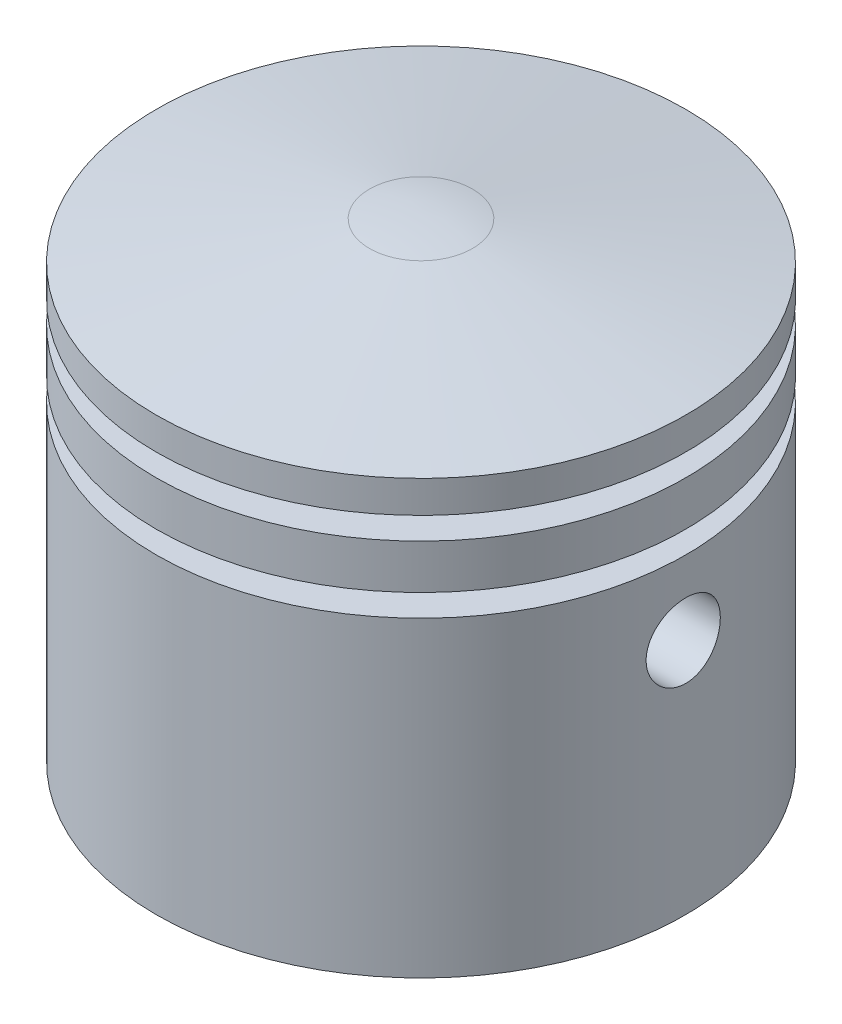
ISO-10303-21;
HEADER;
FILE_DESCRIPTION(('STEP AP214'),'2;1');
FILE_NAME('part.step','',(''),(''),'','','');
FILE_SCHEMA(('AUTOMOTIVE_DESIGN { 1 0 10303 214 1 1 1 1 }'));
ENDSEC;
DATA;
#1=APPLICATION_CONTEXT('core data for automotive mechanical design processes');
#2=APPLICATION_PROTOCOL_DEFINITION('international standard','automotive_design',2000,#1);
#3=PRODUCT_CONTEXT('',#1,'mechanical');
#4=PRODUCT('Part','Part','',(#3));
#5=PRODUCT_RELATED_PRODUCT_CATEGORY('part','',(#4));
#6=PRODUCT_DEFINITION_FORMATION('','',#4);
#7=PRODUCT_DEFINITION_CONTEXT('part definition',#1,'design');
#8=PRODUCT_DEFINITION('design','',#6,#7);
#9=PRODUCT_DEFINITION_SHAPE('','',#8);
#10=(LENGTH_UNIT() NAMED_UNIT(*) SI_UNIT(.MILLI.,.METRE.));
#11=(NAMED_UNIT(*) PLANE_ANGLE_UNIT() SI_UNIT($,.RADIAN.));
#12=(NAMED_UNIT(*) SI_UNIT($,.STERADIAN.) SOLID_ANGLE_UNIT());
#13=UNCERTAINTY_MEASURE_WITH_UNIT(LENGTH_MEASURE(1.E-05),#10,'distance_accuracy_value','');
#14=(GEOMETRIC_REPRESENTATION_CONTEXT(3) GLOBAL_UNCERTAINTY_ASSIGNED_CONTEXT((#13)) GLOBAL_UNIT_ASSIGNED_CONTEXT((#10,
#11,#12)) REPRESENTATION_CONTEXT('',''));
#15=CARTESIAN_POINT('',(0.,0.,0.));
#16=DIRECTION('',(0.,0.,1.));
#17=DIRECTION('',(1.,0.,0.));
#18=AXIS2_PLACEMENT_3D('',#15,#16,#17);
#19=CARTESIAN_POINT('',(0.,-0.896664696993895,0.));
#20=DIRECTION('',(0.,1.,0.));
#21=DIRECTION('',(-1.,0.,0.));
#22=AXIS2_PLACEMENT_3D('',#19,#20,#21);
#23=SPHERICAL_SURFACE('',#22,20.);
#24=CARTESIAN_POINT('',(0.,18.7994903632503,0.));
#25=DIRECTION('',(0.,1.,0.));
#26=DIRECTION('',(0.,0.,1.));
#27=AXIS2_PLACEMENT_3D('',#24,#25,#26);
#28=CIRCLE('',#27,3.47296355333832);
#29=CARTESIAN_POINT('',(0.,18.7994903632503,-3.47296355333834));
#30=VERTEX_POINT('',#29);
#31=EDGE_CURVE('E10',#30,#30,#28,.T.);
#32=ORIENTED_EDGE('',*,*,#31,.T.);
#33=EDGE_LOOP('',(#32));
#34=FACE_BOUND('',#33,.T.);
#35=ADVANCED_FACE('F37',(#34),#23,.T.);
#36=CARTESIAN_POINT('',(0.,16.2647861186848,0.));
#37=DIRECTION('',(0.,-1.,0.));
#38=DIRECTION('',(0.,0.,-1.));
#39=AXIS2_PLACEMENT_3D('',#36,#37,#38);
#40=CONICAL_SURFACE('',#39,17.847985653652,1.39626340159548);
#41=CARTESIAN_POINT('',(0.,16.2647861186848,0.));
#42=DIRECTION('',(0.,1.,0.));
#43=DIRECTION('',(0.,0.,1.));
#44=AXIS2_PLACEMENT_3D('',#41,#42,#43);
#45=CIRCLE('',#44,17.847985653652);
#46=CARTESIAN_POINT('',(0.,16.2647861186847,-17.8479856536521));
#47=VERTEX_POINT('',#46);
#48=EDGE_CURVE('E49',#47,#47,#45,.T.);
#49=CARTESIAN_POINT('',(0.,18.7994903632503,-3.47296355333834));
#50=CARTESIAN_POINT('',(0.,18.7730871940361,-3.62270336688327));
#51=CARTESIAN_POINT('',(0.,18.7466840248219,-3.77244318042821));
#52=CARTESIAN_POINT('',(0.,18.6938776863934,-4.07192280751808));
#53=CARTESIAN_POINT('',(0.,18.6674745171792,-4.22166262106301));
#54=CARTESIAN_POINT('',(0.,18.6146681787507,-4.52114224815288));
#55=CARTESIAN_POINT('',(0.,18.5882650095365,-4.67088206169781));
#56=CARTESIAN_POINT('',(0.,18.5354586711081,-4.97036168878768));
#57=CARTESIAN_POINT('',(0.,18.5090555018938,-5.12010150233262));
#58=CARTESIAN_POINT('',(0.,18.4562491634654,-5.41958112942249));
#59=CARTESIAN_POINT('',(0.,18.4298459942512,-5.56932094296742));
#60=CARTESIAN_POINT('',(0.,18.3770396558227,-5.86880057005729));
#61=CARTESIAN_POINT('',(0.,18.3506364866085,-6.01854038360222));
#62=CARTESIAN_POINT('',(0.,18.29783014818,-6.31802001069209));
#63=CARTESIAN_POINT('',(0.,18.2714269789658,-6.46775982423703));
#64=CARTESIAN_POINT('',(0.,18.2186206405374,-6.7672394513269));
#65=CARTESIAN_POINT('',(0.,18.1922174713231,-6.91697926487183));
#66=CARTESIAN_POINT('',(0.,18.1394111328947,-7.2164588919617));
#67=CARTESIAN_POINT('',(0.,18.1130079636805,-7.36619870550664));
#68=CARTESIAN_POINT('',(0.,18.060201625252,-7.6656783325965));
#69=CARTESIAN_POINT('',(0.,18.0337984560378,-7.81541814614144));
#70=CARTESIAN_POINT('',(0.,17.9809921176094,-8.11489777323131));
#71=CARTESIAN_POINT('',(0.,17.9545889483951,-8.26463758677624));
#72=CARTESIAN_POINT('',(0.,17.9017826099667,-8.56411721386611));
#73=CARTESIAN_POINT('',(0.,17.8753794407525,-8.71385702741105));
#74=CARTESIAN_POINT('',(0.,17.822573102324,-9.01333665450091));
#75=CARTESIAN_POINT('',(0.,17.7961699331098,-9.16307646804585));
#76=CARTESIAN_POINT('',(0.,17.7433635946813,-9.46255609513572));
#77=CARTESIAN_POINT('',(0.,17.7169604254671,-9.61229590868065));
#78=CARTESIAN_POINT('',(0.,17.6641540870387,-9.91177553577052));
#79=CARTESIAN_POINT('',(0.,17.6377509178244,-10.0615153493155));
#80=CARTESIAN_POINT('',(0.,17.584944579396,-10.3609949764053));
#81=CARTESIAN_POINT('',(0.,17.5585414101818,-10.5107347899503));
#82=CARTESIAN_POINT('',(0.,17.5057350717533,-10.8102144170401));
#83=CARTESIAN_POINT('',(0.,17.4793319025391,-10.9599542305851));
#84=CARTESIAN_POINT('',(0.,17.4265255641106,-11.2594338576749));
#85=CARTESIAN_POINT('',(0.,17.4001223948964,-11.4091736712199));
#86=CARTESIAN_POINT('',(0.,17.347316056468,-11.7086532983097));
#87=CARTESIAN_POINT('',(0.,17.3209128872537,-11.8583931118547));
#88=CARTESIAN_POINT('',(0.,17.2681065488253,-12.1578727389445));
#89=CARTESIAN_POINT('',(0.,17.2417033796111,-12.3076125524895));
#90=CARTESIAN_POINT('',(0.,17.1888970411826,-12.6070921795793));
#91=CARTESIAN_POINT('',(0.,17.1624938719684,-12.7568319931243));
#92=CARTESIAN_POINT('',(0.,17.1096875335399,-13.0563116202141));
#93=CARTESIAN_POINT('',(0.,17.0832843643257,-13.2060514337591));
#94=CARTESIAN_POINT('',(0.,17.0304780258973,-13.505531060849));
#95=CARTESIAN_POINT('',(0.,17.004074856683,-13.6552708743939));
#96=CARTESIAN_POINT('',(0.,16.9512685182546,-13.9547505014838));
#97=CARTESIAN_POINT('',(0.,16.9248653490404,-14.1044903150287));
#98=CARTESIAN_POINT('',(0.,16.8720590106119,-14.4039699421186));
#99=CARTESIAN_POINT('',(0.,16.8456558413977,-14.5537097556635));
#100=CARTESIAN_POINT('',(0.,16.7928495029692,-14.8531893827534));
#101=CARTESIAN_POINT('',(0.,16.766446333755,-15.0029291962983));
#102=CARTESIAN_POINT('',(0.,16.7136399953266,-15.3024088233882));
#103=CARTESIAN_POINT('',(0.,16.6872368261123,-15.4521486369331));
#104=CARTESIAN_POINT('',(0.,16.6344304876839,-15.751628264023));
#105=CARTESIAN_POINT('',(0.,16.6080273184697,-15.9013680775679));
#106=CARTESIAN_POINT('',(0.,16.5552209800412,-16.2008477046578));
#107=CARTESIAN_POINT('',(0.,16.528817810827,-16.3505875182027));
#108=CARTESIAN_POINT('',(0.,16.4760114723986,-16.6500671452926));
#109=CARTESIAN_POINT('',(0.,16.4496083031843,-16.7998069588375));
#110=CARTESIAN_POINT('',(0.,16.3968019647559,-17.0992865859274));
#111=CARTESIAN_POINT('',(0.,16.3703987955416,-17.2490263994723));
#112=CARTESIAN_POINT('',(0.,16.3175924571132,-17.5485060265622));
#113=CARTESIAN_POINT('',(0.,16.291189287899,-17.6982458401071));
#114=CARTESIAN_POINT('',(0.,16.2647861186848,-17.8479856536521));
#115=B_SPLINE_CURVE_WITH_KNOTS('',3,(#49,#50,#51,#52,#53,#54,#55,#56,#57,#58,#59,#60,#61,#62,
#63,#64,#65,#66,#67,#68,#69,#70,#71,#72,#73,#74,#75,#76,#77,#78,#79,#80,#81,#82,#83,#84,#85,#86,
#87,#88,#89,#90,#91,#92,#93,#94,#95,#96,#97,#98,#99,#100,#101,#102,#103,#104,#105,#106,#107,
#108,#109,#110,#111,#112,#113,#114),.UNSPECIFIED.,.F.,.F.,(4,2,2,2,2,2,2,2,2,2,2,2,2,2,2,2,2,2,
2,2,2,2,2,2,2,2,2,2,2,2,2,2,4),(0.,0.456149374597007,0.912298749194014,1.36844812379102,
1.82459749838803,2.28074687298504,2.73689624758204,3.19304562217905,3.64919499677606,
4.10534437137306,4.56149374597007,5.01764312056708,5.47379249516408,5.92994186976109,
6.3860912443581,6.84224061895511,7.29838999355211,7.75453936814912,8.21068874274613,
8.66683811734313,9.12298749194014,9.57913686653715,10.0352862411342,10.4914356157312,
10.9475849903282,11.4037343649252,11.8598837395222,12.3160331141192,12.7721824887162,
13.2283318633132,13.6844812379102,14.1406306125072,14.5967799871042),.UNSPECIFIED.);
#116=EDGE_CURVE('BSEAM122',#30,#47,#115,.T.);
#117=ORIENTED_EDGE('',*,*,#31,.F.);
#118=ORIENTED_EDGE('',*,*,#48,.T.);
#119=ORIENTED_EDGE('',*,*,#116,.T.);
#120=ORIENTED_EDGE('',*,*,#116,.F.);
#121=EDGE_LOOP('',(#117,#119,#118,#120));
#122=FACE_BOUND('',#121,.T.);
#123=ADVANCED_FACE('F122',(#122),#40,.T.);
#124=CARTESIAN_POINT('',(0.,24.7603988885083,0.));
#125=DIRECTION('',(0.,1.,0.));
#126=DIRECTION('',(0.,0.,1.));
#127=AXIS2_PLACEMENT_3D('',#124,#125,#126);
#128=CYLINDRICAL_SURFACE('',#127,17.847985653652);
#129=ORIENTED_EDGE('',*,*,#48,.F.);
#130=EDGE_LOOP('',(#129));
#131=FACE_BOUND('',#130,.T.);
#132=CARTESIAN_POINT('',(0.,14.1033353030061,0.));
#133=DIRECTION('',(0.,1.,0.));
#134=DIRECTION('',(0.,0.,1.));
#135=AXIS2_PLACEMENT_3D('',#132,#133,#134);
#136=CIRCLE('',#135,17.847985653652);
#137=CARTESIAN_POINT('',(0.,14.1033353030061,17.847985653652));
#138=VERTEX_POINT('',#137);
#139=EDGE_CURVE('E54',#138,#138,#136,.T.);
#140=ORIENTED_EDGE('',*,*,#139,.T.);
#141=EDGE_LOOP('',(#140));
#142=FACE_BOUND('',#141,.T.);
#143=ADVANCED_FACE('F96',(#131,#142),#128,.T.);
#144=CARTESIAN_POINT('',(0.,14.1033353030061,0.));
#145=DIRECTION('',(0.,-1.,0.));
#146=DIRECTION('',(0.,0.,-1.));
#147=AXIS2_PLACEMENT_3D('',#144,#145,#146);
#148=PLANE('',#147);
#149=CARTESIAN_POINT('',(0.,14.1033353030061,0.));
#150=DIRECTION('',(0.,1.,0.));
#151=DIRECTION('',(0.,0.,1.));
#152=AXIS2_PLACEMENT_3D('',#149,#150,#151);
#153=CIRCLE('',#152,14.5);
#154=CARTESIAN_POINT('',(0.,14.1033353030061,14.5));
#155=VERTEX_POINT('',#154);
#156=EDGE_CURVE('E136',#155,#155,#153,.T.);
#157=ORIENTED_EDGE('',*,*,#156,.T.);
#158=EDGE_LOOP('',(#157));
#159=FACE_BOUND('',#158,.T.);
#160=ORIENTED_EDGE('',*,*,#139,.F.);
#161=EDGE_LOOP('',(#160));
#162=FACE_BOUND('',#161,.T.);
#163=ADVANCED_FACE('F118',(#159,#162),#148,.T.);
#164=CARTESIAN_POINT('',(0.,24.7603988885083,0.));
#165=DIRECTION('',(0.,1.,0.));
#166=DIRECTION('',(0.,0.,1.));
#167=AXIS2_PLACEMENT_3D('',#164,#165,#166);
#168=CYLINDRICAL_SURFACE('',#167,14.5);
#169=CARTESIAN_POINT('',(0.,12.6033353030061,0.));
#170=DIRECTION('',(0.,1.,0.));
#171=DIRECTION('',(0.,0.,1.));
#172=AXIS2_PLACEMENT_3D('',#169,#170,#171);
#173=CIRCLE('',#172,14.5);
#174=CARTESIAN_POINT('',(0.,12.6033353030061,14.5));
#175=VERTEX_POINT('',#174);
#176=EDGE_CURVE('E138',#175,#175,#173,.T.);
#177=ORIENTED_EDGE('',*,*,#176,.T.);
#178=EDGE_LOOP('',(#177));
#179=FACE_BOUND('',#178,.T.);
#180=ORIENTED_EDGE('',*,*,#156,.F.);
#181=EDGE_LOOP('',(#180));
#182=FACE_BOUND('',#181,.T.);
#183=ADVANCED_FACE('F114',(#179,#182),#168,.T.);
#184=CARTESIAN_POINT('',(0.,12.6033353030061,0.));
#185=DIRECTION('',(0.,1.,0.));
#186=DIRECTION('',(0.,0.,1.));
#187=AXIS2_PLACEMENT_3D('',#184,#185,#186);
#188=PLANE('',#187);
#189=CARTESIAN_POINT('',(0.,12.6033353030061,0.));
#190=DIRECTION('',(0.,1.,0.));
#191=DIRECTION('',(0.,0.,1.));
#192=AXIS2_PLACEMENT_3D('',#189,#190,#191);
#193=CIRCLE('',#192,17.847985653652);
#194=CARTESIAN_POINT('',(0.,12.6033353030061,17.847985653652));
#195=VERTEX_POINT('',#194);
#196=EDGE_CURVE('E143',#195,#195,#193,.T.);
#197=ORIENTED_EDGE('',*,*,#196,.T.);
#198=EDGE_LOOP('',(#197));
#199=FACE_BOUND('',#198,.T.);
#200=ORIENTED_EDGE('',*,*,#176,.F.);
#201=EDGE_LOOP('',(#200));
#202=FACE_BOUND('',#201,.T.);
#203=ADVANCED_FACE('F111',(#199,#202),#188,.T.);
#204=ORIENTED_EDGE('',*,*,#196,.F.);
#205=EDGE_LOOP('',(#204));
#206=FACE_BOUND('',#205,.T.);
#207=CARTESIAN_POINT('',(0.,9.60333530300611,0.));
#208=DIRECTION('',(0.,1.,0.));
#209=DIRECTION('',(0.,0.,1.));
#210=AXIS2_PLACEMENT_3D('',#207,#208,#209);
#211=CIRCLE('',#210,17.847985653652);
#212=CARTESIAN_POINT('',(0.,9.60333530300611,17.847985653652));
#213=VERTEX_POINT('',#212);
#214=EDGE_CURVE('E146',#213,#213,#211,.T.);
#215=ORIENTED_EDGE('',*,*,#214,.T.);
#216=EDGE_LOOP('',(#215));
#217=FACE_BOUND('',#216,.T.);
#218=ADVANCED_FACE('F97',(#206,#217),#128,.T.);
#219=CARTESIAN_POINT('',(0.,9.60333530300611,0.));
#220=DIRECTION('',(0.,-1.,0.));
#221=DIRECTION('',(0.,0.,-1.));
#222=AXIS2_PLACEMENT_3D('',#219,#220,#221);
#223=PLANE('',#222);
#224=CARTESIAN_POINT('',(0.,9.60333530300611,0.));
#225=DIRECTION('',(0.,1.,0.));
#226=DIRECTION('',(0.,0.,1.));
#227=AXIS2_PLACEMENT_3D('',#224,#225,#226);
#228=CIRCLE('',#227,14.5);
#229=CARTESIAN_POINT('',(0.,9.60333530300611,14.5));
#230=VERTEX_POINT('',#229);
#231=EDGE_CURVE('E149',#230,#230,#228,.T.);
#232=ORIENTED_EDGE('',*,*,#231,.T.);
#233=EDGE_LOOP('',(#232));
#234=FACE_BOUND('',#233,.T.);
#235=ORIENTED_EDGE('',*,*,#214,.F.);
#236=EDGE_LOOP('',(#235));
#237=FACE_BOUND('',#236,.T.);
#238=ADVANCED_FACE('F106',(#234,#237),#223,.T.);
#239=CARTESIAN_POINT('',(0.,24.7603988885083,0.));
#240=DIRECTION('',(0.,1.,0.));
#241=DIRECTION('',(0.,0.,1.));
#242=AXIS2_PLACEMENT_3D('',#239,#240,#241);
#243=CYLINDRICAL_SURFACE('',#242,14.5);
#244=CARTESIAN_POINT('',(0.,8.10333530300611,0.));
#245=DIRECTION('',(0.,1.,0.));
#246=DIRECTION('',(0.,0.,1.));
#247=AXIS2_PLACEMENT_3D('',#244,#245,#246);
#248=CIRCLE('',#247,14.5);
#249=CARTESIAN_POINT('',(0.,8.10333530300611,14.5));
#250=VERTEX_POINT('',#249);
#251=EDGE_CURVE('E152',#250,#250,#248,.T.);
#252=ORIENTED_EDGE('',*,*,#251,.T.);
#253=EDGE_LOOP('',(#252));
#254=FACE_BOUND('',#253,.T.);
#255=ORIENTED_EDGE('',*,*,#231,.F.);
#256=EDGE_LOOP('',(#255));
#257=FACE_BOUND('',#256,.T.);
#258=ADVANCED_FACE('F102',(#254,#257),#243,.T.);
#259=CARTESIAN_POINT('',(0.,8.10333530300611,0.));
#260=DIRECTION('',(0.,1.,0.));
#261=DIRECTION('',(0.,0.,1.));
#262=AXIS2_PLACEMENT_3D('',#259,#260,#261);
#263=PLANE('',#262);
#264=CARTESIAN_POINT('',(0.,8.10333530300611,0.));
#265=DIRECTION('',(0.,1.,0.));
#266=DIRECTION('',(0.,0.,1.));
#267=AXIS2_PLACEMENT_3D('',#264,#265,#266);
#268=CIRCLE('',#267,17.847985653652);
#269=CARTESIAN_POINT('',(0.,8.10333530300611,17.847985653652));
#270=VERTEX_POINT('',#269);
#271=EDGE_CURVE('E155',#270,#270,#268,.T.);
#272=ORIENTED_EDGE('',*,*,#271,.T.);
#273=EDGE_LOOP('',(#272));
#274=FACE_BOUND('',#273,.T.);
#275=ORIENTED_EDGE('',*,*,#251,.F.);
#276=EDGE_LOOP('',(#275));
#277=FACE_BOUND('',#276,.T.);
#278=ADVANCED_FACE('F94',(#274,#277),#263,.T.);
#279=CARTESIAN_POINT('',(-17.847985653652,5.60333530300611,0.));
#280=CARTESIAN_POINT('',(-17.8479835225648,5.60332946479165,0.139692641427366));
#281=CARTESIAN_POINT('',(-17.8463283903032,5.59158737473942,0.279468955845617));
#282=CARTESIAN_POINT('',(-17.8398849942259,5.54493699272942,0.555121931445878));
#283=CARTESIAN_POINT('',(-17.8350935873002,5.5100054602904,0.690994537662279));
#284=CARTESIAN_POINT('',(-17.8229166462015,5.4180342540665,0.954810360228977));
#285=CARTESIAN_POINT('',(-17.8155329837879,5.36101052906309,1.08275921977493));
#286=CARTESIAN_POINT('',(-17.7989896440852,5.22651095829313,1.32725023134948));
#287=CARTESIAN_POINT('',(-17.7898302376368,5.14903823080584,1.44379411881727));
#288=CARTESIAN_POINT('',(-17.7706855231059,4.9752737087845,1.66298670621032));
#289=CARTESIAN_POINT('',(-17.7606955027833,4.87886962367059,1.76554598571566));
#290=CARTESIAN_POINT('',(-17.7410528398393,4.67022043410446,1.95308712452987));
#291=CARTESIAN_POINT('',(-17.7314002156874,4.55797446413477,2.03806802282233));
#292=CARTESIAN_POINT('',(-17.7134793350807,4.32023480932205,2.18838220060143));
#293=CARTESIAN_POINT('',(-17.7052171637829,4.19468662080216,2.25363006431267));
#294=CARTESIAN_POINT('',(-17.6910762166849,3.93427883241827,2.36208033828268));
#295=CARTESIAN_POINT('',(-17.6851973276772,3.79941967518719,2.40528379568947));
#296=CARTESIAN_POINT('',(-17.6765344382577,3.52515381688729,2.46814353961305));
#297=CARTESIAN_POINT('',(-17.6737304314665,3.38578266099233,2.48795210816252));
#298=CARTESIAN_POINT('',(-17.6714738758361,3.10566839873235,2.50393131328998));
#299=CARTESIAN_POINT('',(-17.6720211588018,2.96492536157348,2.50010313615267));
#300=CARTESIAN_POINT('',(-17.6763870426076,2.68713216478573,2.46904219529038));
#301=CARTESIAN_POINT('',(-17.6801820463398,2.55006270481316,2.44197825212681));
#302=CARTESIAN_POINT('',(-17.6905789383057,2.28242995403893,2.36547793276082));
#303=CARTESIAN_POINT('',(-17.6971808965847,2.1518668256886,2.31604099825564));
#304=CARTESIAN_POINT('',(-17.7124741856689,1.90043477926697,2.19601999902772));
#305=CARTESIAN_POINT('',(-17.7211726375959,1.77960081549539,2.12536365301832));
#306=CARTESIAN_POINT('',(-17.739673533919,1.5514405348342,1.96496107542707));
#307=CARTESIAN_POINT('',(-17.7494760415949,1.44411499293755,1.87521374936868));
#308=CARTESIAN_POINT('',(-17.7691850953589,1.24503908801375,1.67824638758369));
#309=CARTESIAN_POINT('',(-17.7790918042799,1.15343244410162,1.57088104871654));
#310=CARTESIAN_POINT('',(-17.7978135428185,0.989517391868025,1.34222270898374));
#311=CARTESIAN_POINT('',(-17.8066285686957,0.917209049668028,1.22092966039983));
#312=CARTESIAN_POINT('',(-17.8221812913173,0.79393884070047,0.967740144788762));
#313=CARTESIAN_POINT('',(-17.8289179937498,0.742987187237265,0.835838640386919));
#314=CARTESIAN_POINT('',(-17.8395464615022,0.663997072844356,0.565236297297153));
#315=CARTESIAN_POINT('',(-17.8434383943314,0.635957262779439,0.426535859465781));
#316=CARTESIAN_POINT('',(-17.8479167989912,0.603775863880306,0.147514183348462));
#317=CARTESIAN_POINT('',(-17.8485306212061,0.599436527051573,0.00721617497862297));
#318=CARTESIAN_POINT('',(-17.84645784116,0.614255633526834,-0.272105290422641));
#319=CARTESIAN_POINT('',(-17.8437713276527,0.633413444938001,-0.411128781627498));
#320=CARTESIAN_POINT('',(-17.8354166812345,0.694518645006138,-0.683362340646907));
#321=CARTESIAN_POINT('',(-17.8297610439444,0.736370549181381,-0.816594257061685));
#322=CARTESIAN_POINT('',(-17.8161006467966,0.841575815901042,-1.07414948591504));
#323=CARTESIAN_POINT('',(-17.8080957890827,0.90493007413885,-1.1984724269836));
#324=CARTESIAN_POINT('',(-17.790559567185,1.05181164121694,-1.43555589810965));
#325=CARTESIAN_POINT('',(-17.7810187637585,1.13546542833122,-1.54823735974279));
#326=CARTESIAN_POINT('',(-17.7615043722041,1.32039416036005,-1.75803194455331));
#327=CARTESIAN_POINT('',(-17.751530762314,1.42166999210995,-1.85514428373653));
#328=CARTESIAN_POINT('',(-17.7321890851374,1.63984451190527,-2.03175603455248));
#329=CARTESIAN_POINT('',(-17.7228258990092,1.75685051414934,-2.1111234917265));
#330=CARTESIAN_POINT('',(-17.705849115733,2.00264913173857,-2.24907768390745));
#331=CARTESIAN_POINT('',(-17.6982354762232,2.1314414615965,-2.30766492208325));
#332=CARTESIAN_POINT('',(-17.685654361498,2.39674984378573,-2.40218724601355));
#333=CARTESIAN_POINT('',(-17.6806785407725,2.53324000695685,-2.43819383919391));
#334=CARTESIAN_POINT('',(-17.673913549615,2.81040437524112,-2.48676156540788));
#335=CARTESIAN_POINT('',(-17.6721241895261,2.95107833082947,-2.49932409382725));
#336=CARTESIAN_POINT('',(-17.6719411693205,3.23130295764214,-2.50061705742535));
#337=CARTESIAN_POINT('',(-17.6735179593489,3.37085269740055,-2.48955488248169));
#338=CARTESIAN_POINT('',(-17.6798256451657,3.64608725381823,-2.44435468177093));
#339=CARTESIAN_POINT('',(-17.6845565383477,3.78177207367123,-2.41021667507292));
#340=CARTESIAN_POINT('',(-17.696629544541,4.0453802649898,-2.31990372071007));
#341=CARTESIAN_POINT('',(-17.703970160798,4.17330803622804,-2.26374140274841));
#342=CARTESIAN_POINT('',(-17.7204375815168,4.41795819491633,-2.13099450566519));
#343=CARTESIAN_POINT('',(-17.7295644306998,4.5346803017045,-2.05440941520749));
#344=CARTESIAN_POINT('',(-17.7486716255592,4.75466240572712,-1.88223053284));
#345=CARTESIAN_POINT('',(-17.7586584886902,4.85780125986457,-1.78648267226112));
#346=CARTESIAN_POINT('',(-17.7783047006819,5.04662341604838,-1.5790209807727));
#347=CARTESIAN_POINT('',(-17.7879639724651,5.1323026335308,-1.46730342423778));
#348=CARTESIAN_POINT('',(-17.8059187409438,5.28413273305734,-1.23045141376072));
#349=CARTESIAN_POINT('',(-17.8142075068437,5.350188434274,-1.10525545381533));
#350=CARTESIAN_POINT('',(-17.8284206798904,5.46023894216722,-0.845494059864789));
#351=CARTESIAN_POINT('',(-17.83434758508,5.50425706978119,-0.710938702835508));
#352=CARTESIAN_POINT('',(-17.8417843711052,5.55876491641623,-0.479782982735384));
#353=CARTESIAN_POINT('',(-17.8440981682039,5.57545391397151,-0.384623151109395));
#354=CARTESIAN_POINT('',(-17.8471995379177,5.59774106777931,-0.192988851189324));
#355=CARTESIAN_POINT('',(-17.8479871260317,5.60333933665983,-0.0965143962554556));
#356=CARTESIAN_POINT('',(-17.847985653652,5.60333530300611,0.));
#357=B_SPLINE_CURVE_WITH_KNOTS('',3,(#279,#280,#281,#282,#283,#284,#285,#286,#287,#288,#289,
#290,#291,#292,#293,#294,#295,#296,#297,#298,#299,#300,#301,#302,#303,#304,#305,#306,#307,#308,
#309,#310,#311,#312,#313,#314,#315,#316,#317,#318,#319,#320,#321,#322,#323,#324,#325,#326,#327,
#328,#329,#330,#331,#332,#333,#334,#335,#336,#337,#338,#339,#340,#341,#342,#343,#344,#345,#346,
#347,#348,#349,#350,#351,#352,#353,#354,#355,#356),.UNSPECIFIED.,.T.,.F.,(4,2,2,2,2,2,2,2,2,2,2,
2,2,2,2,2,2,2,2,2,2,2,2,2,2,2,2,2,2,2,2,2,2,2,2,2,2,2,4),(0.,0.418725309112512,
0.837870899938002,1.25671446360379,1.675494194454,2.09683731618691,2.51820346681489,
2.94136825101228,3.36451293226745,3.78488782765553,4.2052416253741,4.62256692114846,
5.03990263156548,5.45867638727752,5.87747415755759,6.29991766740945,6.72236262465439,
7.14500937581651,7.56763123816003,7.98672145082105,8.40580039342108,8.82312960722172,
9.24047620725385,9.66049308707484,10.0805311105039,10.5035957733935,10.9266501915641,
11.3483580427,11.7700407930733,12.1880370182021,12.6060328979133,13.0237894301934,
13.4415564230549,13.8628279305842,14.2841978788777,14.7075794438357,15.1305120194239,
15.419814522401,15.7091140874528),.UNSPECIFIED.);
#358=CARTESIAN_POINT('',(-17.847985653652,5.60333530300611,0.));
#359=VERTEX_POINT('',#358);
#360=EDGE_CURVE('E83',#359,#359,#357,.T.);
#361=ORIENTED_EDGE('',*,*,#360,.T.);
#362=EDGE_LOOP('',(#361));
#363=FACE_BOUND('',#362,.T.);
#364=CARTESIAN_POINT('',(17.6720285166409,3.10333530300611,-2.5));
#365=CARTESIAN_POINT('',(17.6720307270503,2.9636502400718,-2.49999415522078));
#366=CARTESIAN_POINT('',(17.6737025905982,2.82388148298275,-2.48825329617596));
#367=CARTESIAN_POINT('',(17.6802057179135,2.54824420698894,-2.44160824770182));
#368=CARTESIAN_POINT('',(17.6850401552266,2.41237974904244,-2.40668079071317));
#369=CARTESIAN_POINT('',(17.6973103597266,2.14858116470404,-2.31472150396986));
#370=CARTESIAN_POINT('',(17.7047442269058,2.02064132613517,-2.25770581594565));
#371=CARTESIAN_POINT('',(17.7213734154101,1.77616546104474,-2.12322517800563));
#372=CARTESIAN_POINT('',(17.7305684697454,1.65962771004721,-2.04576332698428));
#373=CARTESIAN_POINT('',(17.7497559504296,1.44042832218146,-1.87200984587674));
#374=CARTESIAN_POINT('',(17.7597530036563,1.33785801910686,-1.77560349049687));
#375=CARTESIAN_POINT('',(17.779376648111,1.15029556772988,-1.56694511471852));
#376=CARTESIAN_POINT('',(17.7890032197772,1.06530434658815,-1.45469225906477));
#377=CARTESIAN_POINT('',(17.8068492672477,0.914979271634136,-1.21694644348209));
#378=CARTESIAN_POINT('',(17.8150627008475,0.849728965797626,-1.0914001645571));
#379=CARTESIAN_POINT('',(17.8291059464406,0.741273651864333,-0.830996522273949));
#380=CARTESIAN_POINT('',(17.8349358686289,0.698067624590162,-0.696139589704376));
#381=CARTESIAN_POINT('',(17.8435225947359,0.635202661785006,-0.421881064016667));
#382=CARTESIAN_POINT('',(17.8462993006778,0.615391168407239,-0.282515073029192));
#383=CARTESIAN_POINT('',(17.8485348455539,0.59940432351756,-0.00241096216958622));
#384=CARTESIAN_POINT('',(17.8479938464035,0.603227818536203,0.138327090406488));
#385=CARTESIAN_POINT('',(17.8436709216892,0.63428124305461,0.416140657817342));
#386=CARTESIAN_POINT('',(17.8399117189463,0.661347069192128,0.553234919369596));
#387=CARTESIAN_POINT('',(17.8296001365473,0.737859711212259,0.820916297032406));
#388=CARTESIAN_POINT('',(17.8230476926426,0.787307041903551,0.951503263388562));
#389=CARTESIAN_POINT('',(17.8078467118062,0.907349776797707,1.20296460682772));
#390=CARTESIAN_POINT('',(17.7991912659846,0.978015071587924,1.32380518488161));
#391=CARTESIAN_POINT('',(17.7807505042092,1.13843686186304,1.55197491987337));
#392=CARTESIAN_POINT('',(17.7709651233037,1.22819445507386,1.65930329935225));
#393=CARTESIAN_POINT('',(17.7512583055952,1.42516923071622,1.85836799553877));
#394=CARTESIAN_POINT('',(17.7413364217551,1.53252958778557,1.94996265422384));
#395=CARTESIAN_POINT('',(17.722557139336,1.76117364377709,2.11385587954385));
#396=CARTESIAN_POINT('',(17.7136997458241,1.88245740896867,2.18615435433184));
#397=CARTESIAN_POINT('',(17.6980525704563,2.13564413997355,2.30941740997226));
#398=CARTESIAN_POINT('',(17.6912640697522,2.26755362205565,2.36036877902122));
#399=CARTESIAN_POINT('',(17.6805468916005,2.53817334526483,2.43935589241043));
#400=CARTESIAN_POINT('',(17.676618039537,2.67688317059708,2.46739303595232));
#401=CARTESIAN_POINT('',(17.6720976632493,2.95590963641922,2.4995643508175));
#402=CARTESIAN_POINT('',(17.6714781881737,3.09620275768171,2.50389872210173));
#403=CARTESIAN_POINT('',(17.6735726208081,3.37551326626855,2.48907142866801));
#404=CARTESIAN_POINT('',(17.6762864387321,3.51453068785367,2.46991039682473));
#405=CARTESIAN_POINT('',(17.6847160771161,3.78673188572243,2.40880549680821));
#406=CARTESIAN_POINT('',(17.6904189063278,3.91993822599443,2.3669601953237));
#407=CARTESIAN_POINT('',(17.7041733729064,4.17744521339544,2.26177667145646));
#408=CARTESIAN_POINT('',(17.7122251124619,4.30174547277517,2.19843751397086));
#409=CARTESIAN_POINT('',(17.729836494459,4.53881280211918,2.05157855529008));
#410=CARTESIAN_POINT('',(17.7394057289707,4.65149842643543,1.96792845001442));
#411=CARTESIAN_POINT('',(17.7589445053983,4.86130311782748,1.78300452983451));
#412=CARTESIAN_POINT('',(17.7689140669535,4.95842142003281,1.68172984949021));
#413=CARTESIAN_POINT('',(17.7882169257598,5.13504704138153,1.46355287623689));
#414=CARTESIAN_POINT('',(17.7975451096636,5.21442215095042,1.34654303448924));
#415=CARTESIAN_POINT('',(17.814436016703,5.35238975615737,1.10073460291889));
#416=CARTESIAN_POINT('',(17.8219987829767,5.41098275962639,0.971936301255451));
#417=CARTESIAN_POINT('',(17.8344842185033,5.50550869165934,0.706630893569478));
#418=CARTESIAN_POINT('',(17.839415501755,5.54151562312759,0.570150576474428));
#419=CARTESIAN_POINT('',(17.8461183527375,5.59008735866944,0.293007053528957));
#420=CARTESIAN_POINT('',(17.8478901013391,5.60265350463828,0.152344087587545));
#421=CARTESIAN_POINT('',(17.848072846379,5.60395742352996,-0.12788599030519));
#422=CARTESIAN_POINT('',(17.8465124649667,5.59289813264483,-0.267452182212226));
#423=CARTESIAN_POINT('',(17.8402636290386,5.54769792993876,-0.54272038520849));
#424=CARTESIAN_POINT('',(17.8355751809729,5.5135570657126,-0.678422404265138));
#425=CARTESIAN_POINT('',(17.8235945118079,5.42323146934987,-0.942066528579054));
#426=CARTESIAN_POINT('',(17.8163037393608,5.3670589999698,-1.07001290495482));
#427=CARTESIAN_POINT('',(17.7999219267774,5.23428601045547,-1.31469606665824));
#428=CARTESIAN_POINT('',(17.7908308434407,5.15768500010219,-1.431432582894));
#429=CARTESIAN_POINT('',(17.77176776105,4.98548812618776,-1.65141499853849));
#430=CARTESIAN_POINT('',(17.7617891584155,4.88974186498259,-1.75454260744101));
#431=CARTESIAN_POINT('',(17.7421262729209,4.68228806373244,-1.94334281928297));
#432=CARTESIAN_POINT('',(17.7324420598968,4.57057677169989,-2.02901130759041));
#433=CARTESIAN_POINT('',(17.7144140777963,4.33373033288095,-2.18082928857424));
#434=CARTESIAN_POINT('',(17.7060770574921,4.20853253763213,-2.24688181777335));
#435=CARTESIAN_POINT('',(17.6917664088102,3.94876735714335,-2.35692589372));
#436=CARTESIAN_POINT('',(17.6857902796714,3.81421006460435,-2.40094079699257));
#437=CARTESIAN_POINT('',(17.6782884216747,3.58306288036237,-2.45543996846356));
#438=CARTESIAN_POINT('',(17.6759530831891,3.48791412509124,-2.47212506624748));
#439=CARTESIAN_POINT('',(17.6728223752357,3.29630198717328,-2.49440704260002));
#440=CARTESIAN_POINT('',(17.6720269895496,3.19983861838228,-2.5000040379448));
#441=CARTESIAN_POINT('',(17.6720285166409,3.10333530300611,-2.5));
#442=B_SPLINE_CURVE_WITH_KNOTS('',3,(#364,#365,#366,#367,#368,#369,#370,#371,#372,#373,#374,
#375,#376,#377,#378,#379,#380,#381,#382,#383,#384,#385,#386,#387,#388,#389,#390,#391,#392,#393,
#394,#395,#396,#397,#398,#399,#400,#401,#402,#403,#404,#405,#406,#407,#408,#409,#410,#411,#412,
#413,#414,#415,#416,#417,#418,#419,#420,#421,#422,#423,#424,#425,#426,#427,#428,#429,#430,#431,
#432,#433,#434,#435,#436,#437,#438,#439,#440,#441),.UNSPECIFIED.,.T.,.F.,(4,2,2,2,2,2,2,2,2,2,2,
2,2,2,2,2,2,2,2,2,2,2,2,2,2,2,2,2,2,2,2,2,2,2,2,2,2,2,4),(0.,0.418702540036061,
0.837825881025652,1.25664350931292,1.67539769649741,2.09677062192665,2.51816576585537,
2.94132017279284,3.3644550141777,3.78481504413223,4.20515455922066,4.62255042611915,
5.03995589424596,5.4587516397464,5.87757147073222,6.29998422320719,6.72239898626822,
7.14507479858668,7.56772479930214,7.98679940688589,8.40586272647955,8.82311957770856,
9.24039458427041,9.66042082085585,10.0804676883018,10.5035471981421,10.9266163689108,
11.3482920186412,11.769943528314,12.187987735181,12.6060310800328,13.0238420720747,
13.4416630911339,13.8629053081581,14.2842466858158,14.7076373912311,15.1305784120928,
15.4198477725539,15.7091140865112),.UNSPECIFIED.);
#443=CARTESIAN_POINT('',(17.6720285166409,3.10333530300611,-2.5));
#444=VERTEX_POINT('',#443);
#445=EDGE_CURVE('E77',#444,#444,#442,.T.);
#446=ORIENTED_EDGE('',*,*,#445,.T.);
#447=EDGE_LOOP('',(#446));
#448=FACE_BOUND('',#447,.T.);
#449=ORIENTED_EDGE('',*,*,#271,.F.);
#450=EDGE_LOOP('',(#449));
#451=FACE_BOUND('',#450,.T.);
#452=CARTESIAN_POINT('',(0.,-12.8966646969939,0.));
#453=DIRECTION('',(0.,1.,0.));
#454=DIRECTION('',(0.,0.,1.));
#455=AXIS2_PLACEMENT_3D('',#452,#453,#454);
#456=CIRCLE('',#455,17.847985653652);
#457=CARTESIAN_POINT('',(0.,-12.8966646969939,17.847985653652));
#458=VERTEX_POINT('',#457);
#459=EDGE_CURVE('E158',#458,#458,#456,.T.);
#460=ORIENTED_EDGE('',*,*,#459,.T.);
#461=EDGE_LOOP('',(#460));
#462=FACE_BOUND('',#461,.T.);
#463=ADVANCED_FACE('F88',(#363,#448,#451,#462),#128,.T.);
#464=CARTESIAN_POINT('',(0.,-12.8966646969939,0.));
#465=DIRECTION('',(0.,1.,0.));
#466=DIRECTION('',(0.,0.,1.));
#467=AXIS2_PLACEMENT_3D('',#464,#465,#466);
#468=PLANE('',#467);
#469=ORIENTED_EDGE('',*,*,#459,.F.);
#470=EDGE_LOOP('',(#469));
#471=FACE_BOUND('',#470,.T.);
#472=CARTESIAN_POINT('',(0.,-12.8966646969939,0.));
#473=DIRECTION('',(0.,1.,0.));
#474=DIRECTION('',(0.,0.,1.));
#475=AXIS2_PLACEMENT_3D('',#472,#473,#474);
#476=CIRCLE('',#475,13.);
#477=CARTESIAN_POINT('',(0.,-12.8966646969939,13.));
#478=VERTEX_POINT('',#477);
#479=EDGE_CURVE('E161',#478,#478,#476,.T.);
#480=ORIENTED_EDGE('',*,*,#479,.T.);
#481=EDGE_LOOP('',(#480));
#482=FACE_BOUND('',#481,.T.);
#483=ADVANCED_FACE('F93',(#471,#482),#468,.F.);
#484=CARTESIAN_POINT('',(0.,24.7603988885083,0.));
#485=DIRECTION('',(0.,1.,0.));
#486=DIRECTION('',(0.,0.,1.));
#487=AXIS2_PLACEMENT_3D('',#484,#485,#486);
#488=CYLINDRICAL_SURFACE('',#487,13.);
#489=CARTESIAN_POINT('',(0.,-2.89666469699389,0.));
#490=DIRECTION('',(0.,1.,0.));
#491=DIRECTION('',(0.,0.,1.));
#492=AXIS2_PLACEMENT_3D('',#489,#490,#491);
#493=CIRCLE('',#492,13.);
#494=CARTESIAN_POINT('',(0.,-2.89666469699389,13.));
#495=VERTEX_POINT('',#494);
#496=EDGE_CURVE('E164',#495,#495,#493,.T.);
#497=ORIENTED_EDGE('',*,*,#496,.T.);
#498=EDGE_LOOP('',(#497));
#499=FACE_BOUND('',#498,.T.);
#500=ORIENTED_EDGE('',*,*,#479,.F.);
#501=EDGE_LOOP('',(#500));
#502=FACE_BOUND('',#501,.T.);
#503=ADVANCED_FACE('F185',(#499,#502),#488,.F.);
#504=CARTESIAN_POINT('',(0.,-2.89666469699389,0.));
#505=DIRECTION('',(0.,-1.,0.));
#506=DIRECTION('',(0.,0.,-1.));
#507=AXIS2_PLACEMENT_3D('',#504,#505,#506);
#508=PLANE('',#507);
#509=CARTESIAN_POINT('',(0.,-2.89666469699389,0.));
#510=DIRECTION('',(0.,1.,0.));
#511=DIRECTION('',(0.,0.,1.));
#512=AXIS2_PLACEMENT_3D('',#509,#510,#511);
#513=CIRCLE('',#512,10.);
#514=CARTESIAN_POINT('',(0.,-2.89666469699389,10.));
#515=VERTEX_POINT('',#514);
#516=EDGE_CURVE('E167',#515,#515,#513,.T.);
#517=ORIENTED_EDGE('',*,*,#516,.T.);
#518=EDGE_LOOP('',(#517));
#519=FACE_BOUND('',#518,.T.);
#520=ORIENTED_EDGE('',*,*,#496,.F.);
#521=EDGE_LOOP('',(#520));
#522=FACE_BOUND('',#521,.T.);
#523=ADVANCED_FACE('F189',(#519,#522),#508,.T.);
#524=CARTESIAN_POINT('',(0.,24.7603988885083,0.));
#525=DIRECTION('',(0.,1.,0.));
#526=DIRECTION('',(0.,0.,1.));
#527=AXIS2_PLACEMENT_3D('',#524,#525,#526);
#528=CYLINDRICAL_SURFACE('',#527,10.);
#529=CARTESIAN_POINT('',(-9.68245836551854,3.10333530300611,-2.5));
#530=CARTESIAN_POINT('',(-9.6824610008786,3.24138605393269,-2.49999607859307));
#531=CARTESIAN_POINT('',(-9.68544306014597,3.37948020168463,-2.48852624549765));
#532=CARTESIAN_POINT('',(-9.69701861992563,3.65170288117962,-2.44302312546379));
#533=CARTESIAN_POINT('',(-9.7056153862163,3.78582905747429,-2.40897670674211));
#534=CARTESIAN_POINT('',(-9.7273872459615,4.04613884119329,-2.31949119963204));
#535=CARTESIAN_POINT('',(-9.74055642690458,4.17233245839182,-2.26407972785449));
#536=CARTESIAN_POINT('',(-9.76998192028758,4.41364615554599,-2.13352114126138));
#537=CARTESIAN_POINT('',(-9.78623836378489,4.52876576508633,-2.05837318856068));
#538=CARTESIAN_POINT('',(-9.82040716355625,4.74719694826832,-1.88870842731188));
#539=CARTESIAN_POINT('',(-9.83834597623034,4.85022890335616,-1.79383688770405));
#540=CARTESIAN_POINT('',(-9.87362875515293,5.03909669736645,-1.58818206410066));
#541=CARTESIAN_POINT('',(-9.89097266566388,5.12493092862786,-1.47739729418031));
#542=CARTESIAN_POINT('',(-9.92340415520582,5.27811077063739,-1.24114520107895));
#543=CARTESIAN_POINT('',(-9.93845687400592,5.34518169116758,-1.11549457619512));
#544=CARTESIAN_POINT('',(-9.96430811925983,5.45714494715919,-0.854263184292761));
#545=CARTESIAN_POINT('',(-9.97510727334344,5.50204055492162,-0.718683885791939));
#546=CARTESIAN_POINT('',(-9.9910475884818,5.56748313758469,-0.44435875875416));
#547=CARTESIAN_POINT('',(-9.99629893844314,5.58850494733269,-0.305732719548974));
#548=CARTESIAN_POINT('',(-10.000935941073,5.60709368228166,-0.0268288192627676));
#549=CARTESIAN_POINT('',(-10.000322460967,5.60466407521571,0.11344879453807));
#550=CARTESIAN_POINT('',(-9.99338094953533,5.57676045275596,0.38838061793097));
#551=CARTESIAN_POINT('',(-9.9871800234087,5.55179897795225,0.523090539002669));
#552=CARTESIAN_POINT('',(-9.96990836524857,5.48036403295761,0.786345618534217));
#553=CARTESIAN_POINT('',(-9.95883737398452,5.4338894176287,0.914890448426097));
#554=CARTESIAN_POINT('',(-9.93287509700884,5.32033273231905,1.16351675875452));
#555=CARTESIAN_POINT('',(-9.9179501969501,5.25306825834436,1.28351127441626));
#556=CARTESIAN_POINT('',(-9.88589903809691,5.09997962388985,1.51068905585122));
#557=CARTESIAN_POINT('',(-9.86877239652649,5.01415223444548,1.61787008771377));
#558=CARTESIAN_POINT('',(-9.83363713769356,4.82362656102374,1.81943508771239));
#559=CARTESIAN_POINT('',(-9.81561719525297,4.71848041065836,1.91339419768799));
#560=CARTESIAN_POINT('',(-9.78115043517327,4.49373532946583,2.08244093990755));
#561=CARTESIAN_POINT('',(-9.76470369108288,4.374135723515,2.15752769011507));
#562=CARTESIAN_POINT('',(-9.73520496829319,4.12304526885725,2.28697032255647));
#563=CARTESIAN_POINT('',(-9.72216983717007,3.9914995726933,2.34122391742613));
#564=CARTESIAN_POINT('',(-9.70118640148668,3.72074983492926,2.42671405159096));
#565=CARTESIAN_POINT('',(-9.69323700842732,3.58154743902151,2.45795551638266));
#566=CARTESIAN_POINT('',(-9.68355356007456,3.30337580147619,2.49582963866592));
#567=CARTESIAN_POINT('',(-9.68166088976933,3.16449750966508,2.50309047391912));
#568=CARTESIAN_POINT('',(-9.68387343364692,2.88751336642085,2.49451699051516));
#569=CARTESIAN_POINT('',(-9.687978095703,2.74940744505667,2.4786847978498));
#570=CARTESIAN_POINT('',(-9.70157081984979,2.48022103805753,2.42492546393825));
#571=CARTESIAN_POINT('',(-9.71096970242531,2.34906257643691,2.3873640682819));
#572=CARTESIAN_POINT('',(-9.73400718262805,2.09490384515278,2.29161808167046));
#573=CARTESIAN_POINT('',(-9.74764628246407,1.97190454395032,2.2334310477125));
#574=CARTESIAN_POINT('',(-9.77796137095511,1.73489402513921,2.0967706679366));
#575=CARTESIAN_POINT('',(-9.79469168607244,1.62110646296313,2.01792175383564));
#576=CARTESIAN_POINT('',(-9.82917083071112,1.40814694020463,1.84265073233613));
#577=CARTESIAN_POINT('',(-9.84691982728306,1.308977386356,1.74622573701359));
#578=CARTESIAN_POINT('',(-9.88197403031773,1.12552426043518,1.53565680246182));
#579=CARTESIAN_POINT('',(-9.8992570206188,1.0416752404573,1.42112988132898));
#580=CARTESIAN_POINT('',(-9.93097216613689,0.894399436054855,1.17925670673669));
#581=CARTESIAN_POINT('',(-9.94540447003949,0.830971586397899,1.05191112239398));
#582=CARTESIAN_POINT('',(-9.96970115738324,0.726889268478178,0.788895504327725));
#583=CARTESIAN_POINT('',(-9.97959830022409,0.686071018627043,0.653293452569705));
#584=CARTESIAN_POINT('',(-9.99385293395788,0.627874968397693,0.376874400797017));
#585=CARTESIAN_POINT('',(-9.99821149393421,0.610492644267069,0.2360584126031));
#586=CARTESIAN_POINT('',(-10.0008542352201,0.599916329067261,-0.0427088161083094));
#587=CARTESIAN_POINT('',(-9.99929947199971,0.606081030267588,-0.180634567415056));
#588=CARTESIAN_POINT('',(-9.99064741143608,0.640954871241981,-0.453418741036878));
#589=CARTESIAN_POINT('',(-9.98355027892922,0.66966334053903,-0.588277254452323));
#590=CARTESIAN_POINT('',(-9.96463582134722,0.748465852433261,-0.850427589111937));
#591=CARTESIAN_POINT('',(-9.95284411255981,0.798443936292055,-0.977756236452158));
#592=CARTESIAN_POINT('',(-9.92578222284144,0.918261750555038,-1.22229263260406));
#593=CARTESIAN_POINT('',(-9.91051160346893,0.98810398468232,-1.33949910316408));
#594=CARTESIAN_POINT('',(-9.87768124200717,1.14762338799644,-1.56350482105826));
#595=CARTESIAN_POINT('',(-9.86007542354161,1.23773566026568,-1.66998747074584));
#596=CARTESIAN_POINT('',(-9.82476622642974,1.43439243294948,-1.86653755068376));
#597=CARTESIAN_POINT('',(-9.80706282418255,1.54094109328402,-1.95660081269148));
#598=CARTESIAN_POINT('',(-9.77318689613756,1.76983883847976,-2.11940506617958));
#599=CARTESIAN_POINT('',(-9.75704909183221,1.89244561141924,-2.19179154854095));
#600=CARTESIAN_POINT('',(-9.72859888737069,2.14847402769316,-2.31481724146367));
#601=CARTESIAN_POINT('',(-9.71628370583034,2.28188771824073,-2.36547227438038));
#602=CARTESIAN_POINT('',(-9.69879771876843,2.52977783259401,-2.43605632142751));
#603=CARTESIAN_POINT('',(-9.69271657508747,2.64306821397145,-2.4599829264922));
#604=CARTESIAN_POINT('',(-9.6845459645655,2.87200747550033,-2.49195573142942));
#605=CARTESIAN_POINT('',(-9.68245615722769,2.98765615361711,-2.50000328592938));
#606=CARTESIAN_POINT('',(-9.68245836551854,3.10333530300611,-2.5));
#607=B_SPLINE_CURVE_WITH_KNOTS('',3,(#529,#530,#531,#532,#533,#534,#535,#536,#537,#538,#539,
#540,#541,#542,#543,#544,#545,#546,#547,#548,#549,#550,#551,#552,#553,#554,#555,#556,#557,#558,
#559,#560,#561,#562,#563,#564,#565,#566,#567,#568,#569,#570,#571,#572,#573,#574,#575,#576,#577,
#578,#579,#580,#581,#582,#583,#584,#585,#586,#587,#588,#589,#590,#591,#592,#593,#594,#595,#596,
#597,#598,#599,#600,#601,#602,#603,#604,#605,#606),.UNSPECIFIED.,.T.,.F.,(4,2,2,2,2,2,2,2,2,2,2,
2,2,2,2,2,2,2,2,2,2,2,2,2,2,2,2,2,2,2,2,2,2,2,2,2,2,2,4),(0.,0.413727441736137,
0.827695741428667,1.24113072716602,1.65458326755479,2.07623954192976,2.49793521479867,
2.9255149639792,3.35303159847093,3.77188750995347,4.19068148666021,4.60018262688947,
5.00970556724786,5.42292874254445,5.83622385468914,6.26070466571912,6.68520531199802,
7.11176432008403,7.53823200129548,7.95343574764204,8.36860127188747,8.77697405014152,
9.18539521426363,9.60182845864103,10.0183301888999,10.4452533097026,10.872154157245,
11.2959207281187,11.7196054891398,12.131834461324,12.5440511738193,12.9540487656466,
13.3640980574302,13.7839709658702,14.2039503157045,14.6317647729113,15.0592672137502,
15.4059782718573,15.7526597510792),.UNSPECIFIED.);
#608=CARTESIAN_POINT('',(-9.68245836551854,3.10333530300611,-2.5));
#609=VERTEX_POINT('',#608);
#610=EDGE_CURVE('E40',#609,#609,#607,.T.);
#611=ORIENTED_EDGE('',*,*,#610,.F.);
#612=EDGE_LOOP('',(#611));
#613=FACE_BOUND('',#612,.T.);
#614=CARTESIAN_POINT('',(9.68245836551854,3.10333530300611,-2.5));
#615=CARTESIAN_POINT('',(9.6824610008786,2.96528455207953,-2.49999607859307));
#616=CARTESIAN_POINT('',(9.68544306014597,2.82719040432759,-2.48852624549765));
#617=CARTESIAN_POINT('',(9.69701861992563,2.5549677248326,-2.44302312546379));
#618=CARTESIAN_POINT('',(9.7056153862163,2.42084154853792,-2.40897670674211));
#619=CARTESIAN_POINT('',(9.7273872459615,2.16053176481893,-2.31949119963204));
#620=CARTESIAN_POINT('',(9.74055642690457,2.0343381476204,-2.26407972785449));
#621=CARTESIAN_POINT('',(9.76998192028758,1.79302445046623,-2.13352114126138));
#622=CARTESIAN_POINT('',(9.78623836378489,1.67790484092589,-2.05837318856069));
#623=CARTESIAN_POINT('',(9.82040716355625,1.45947365774389,-1.88870842731188));
#624=CARTESIAN_POINT('',(9.83834597623034,1.35644170265606,-1.79383688770405));
#625=CARTESIAN_POINT('',(9.87362875515293,1.16757390864577,-1.58818206410066));
#626=CARTESIAN_POINT('',(9.89097266566388,1.08173967738436,-1.47739729418031));
#627=CARTESIAN_POINT('',(9.92340415520582,0.92855983537483,-1.24114520107895));
#628=CARTESIAN_POINT('',(9.93845687400592,0.861488914844643,-1.11549457619512));
#629=CARTESIAN_POINT('',(9.96430811925983,0.749525658853025,-0.854263184292762));
#630=CARTESIAN_POINT('',(9.97510727334344,0.704630051090593,-0.71868388579194));
#631=CARTESIAN_POINT('',(9.9910475884818,0.639187468427522,-0.444358758754161));
#632=CARTESIAN_POINT('',(9.99629893844314,0.618165658679526,-0.305732719548975));
#633=CARTESIAN_POINT('',(10.000935941073,0.599576923730554,-0.026828819262769));
#634=CARTESIAN_POINT('',(10.000322460967,0.602006530796508,0.113448794538069));
#635=CARTESIAN_POINT('',(9.99338094953533,0.629910153256252,0.388380617930968));
#636=CARTESIAN_POINT('',(9.9871800234087,0.654871628059964,0.523090539002668));
#637=CARTESIAN_POINT('',(9.96990836524857,0.726306573054607,0.786345618534216));
#638=CARTESIAN_POINT('',(9.95883737398452,0.772781188383517,0.914890448426095));
#639=CARTESIAN_POINT('',(9.93287509700884,0.886337873693172,1.16351675875452));
#640=CARTESIAN_POINT('',(9.9179501969501,0.953602347667853,1.28351127441626));
#641=CARTESIAN_POINT('',(9.88589903809691,1.10669098212237,1.51068905585122));
#642=CARTESIAN_POINT('',(9.8687723965265,1.19251837156673,1.61787008771377));
#643=CARTESIAN_POINT('',(9.83363713769356,1.38304404498848,1.81943508771239));
#644=CARTESIAN_POINT('',(9.81561719525297,1.48819019535385,1.91339419768799));
#645=CARTESIAN_POINT('',(9.78115043517327,1.71293527654639,2.08244093990755));
#646=CARTESIAN_POINT('',(9.76470369108288,1.83253488249721,2.15752769011507));
#647=CARTESIAN_POINT('',(9.73520496829319,2.08362533715497,2.28697032255647));
#648=CARTESIAN_POINT('',(9.72216983717007,2.21517103331891,2.34122391742613));
#649=CARTESIAN_POINT('',(9.70118640148668,2.48592077108295,2.42671405159096));
#650=CARTESIAN_POINT('',(9.69323700842732,2.6251231669907,2.45795551638266));
#651=CARTESIAN_POINT('',(9.68355356007456,2.90329480453603,2.49582963866592));
#652=CARTESIAN_POINT('',(9.68166088976933,3.04217309634713,2.50309047391912));
#653=CARTESIAN_POINT('',(9.68387343364692,3.31915723959136,2.49451699051516));
#654=CARTESIAN_POINT('',(9.687978095703,3.45726316095555,2.4786847978498));
#655=CARTESIAN_POINT('',(9.70157081984979,3.72644956795468,2.42492546393825));
#656=CARTESIAN_POINT('',(9.71096970242531,3.85760802957531,2.3873640682819));
#657=CARTESIAN_POINT('',(9.73400718262805,4.11176676085944,2.29161808167046));
#658=CARTESIAN_POINT('',(9.74764628246407,4.23476606206189,2.2334310477125));
#659=CARTESIAN_POINT('',(9.77796137095511,4.471776580873,2.0967706679366));
#660=CARTESIAN_POINT('',(9.79469168607244,4.58556414304909,2.01792175383564));
#661=CARTESIAN_POINT('',(9.82917083071112,4.79852366580758,1.84265073233613));
#662=CARTESIAN_POINT('',(9.84691982728306,4.89769321965622,1.7462257370136));
#663=CARTESIAN_POINT('',(9.88197403031773,5.08114634557703,1.53565680246182));
#664=CARTESIAN_POINT('',(9.8992570206188,5.16499536555491,1.42112988132898));
#665=CARTESIAN_POINT('',(9.93097216613689,5.31227116995736,1.17925670673669));
#666=CARTESIAN_POINT('',(9.94540447003949,5.37569901961432,1.05191112239398));
#667=CARTESIAN_POINT('',(9.96970115738324,5.47978133753404,0.788895504327728));
#668=CARTESIAN_POINT('',(9.97959830022409,5.52059958738517,0.653293452569706));
#669=CARTESIAN_POINT('',(9.99385293395788,5.57879563761452,0.376874400797018));
#670=CARTESIAN_POINT('',(9.99821149393421,5.59617796174515,0.236058412603102));
#671=CARTESIAN_POINT('',(10.0008542352201,5.60675427694496,-0.0427088161083065));
#672=CARTESIAN_POINT('',(9.99929947199971,5.60058957574463,-0.180634567415052));
#673=CARTESIAN_POINT('',(9.99064741143608,5.56571573477024,-0.453418741036875));
#674=CARTESIAN_POINT('',(9.98355027892922,5.53700726547319,-0.58827725445232));
#675=CARTESIAN_POINT('',(9.96463582134722,5.45820475357896,-0.850427589111935));
#676=CARTESIAN_POINT('',(9.95284411255981,5.40822666972016,-0.977756236452157));
#677=CARTESIAN_POINT('',(9.92578222284144,5.28840885545718,-1.22229263260406));
#678=CARTESIAN_POINT('',(9.91051160346893,5.2185666213299,-1.33949910316408));
#679=CARTESIAN_POINT('',(9.87768124200717,5.05904721801578,-1.56350482105826));
#680=CARTESIAN_POINT('',(9.86007542354161,4.96893494574654,-1.66998747074584));
#681=CARTESIAN_POINT('',(9.82476622642974,4.77227817306274,-1.86653755068376));
#682=CARTESIAN_POINT('',(9.80706282418255,4.6657295127282,-1.95660081269147));
#683=CARTESIAN_POINT('',(9.77318689613756,4.43683176753246,-2.11940506617958));
#684=CARTESIAN_POINT('',(9.75704909183222,4.31422499459298,-2.19179154854095));
#685=CARTESIAN_POINT('',(9.7285988873707,4.05819657831906,-2.31481724146367));
#686=CARTESIAN_POINT('',(9.71628370583034,3.92478288777149,-2.36547227438038));
#687=CARTESIAN_POINT('',(9.69879771876843,3.67689277341821,-2.43605632142751));
#688=CARTESIAN_POINT('',(9.69271657508747,3.56360239204077,-2.4599829264922));
#689=CARTESIAN_POINT('',(9.6845459645655,3.33466313051189,-2.49195573142942));
#690=CARTESIAN_POINT('',(9.68245615722769,3.2190144523951,-2.50000328592938));
#691=CARTESIAN_POINT('',(9.68245836551854,3.10333530300611,-2.5));
#692=B_SPLINE_CURVE_WITH_KNOTS('',3,(#614,#615,#616,#617,#618,#619,#620,#621,#622,#623,#624,
#625,#626,#627,#628,#629,#630,#631,#632,#633,#634,#635,#636,#637,#638,#639,#640,#641,#642,#643,
#644,#645,#646,#647,#648,#649,#650,#651,#652,#653,#654,#655,#656,#657,#658,#659,#660,#661,#662,
#663,#664,#665,#666,#667,#668,#669,#670,#671,#672,#673,#674,#675,#676,#677,#678,#679,#680,#681,
#682,#683,#684,#685,#686,#687,#688,#689,#690,#691),.UNSPECIFIED.,.T.,.F.,(4,2,2,2,2,2,2,2,2,2,2,
2,2,2,2,2,2,2,2,2,2,2,2,2,2,2,2,2,2,2,2,2,2,2,2,2,2,2,4),(0.,0.413727441736137,
0.827695741428666,1.24113072716602,1.65458326755479,2.07623954192976,2.49793521479867,
2.9255149639792,3.35303159847092,3.77188750995347,4.19068148666021,4.60018262688947,
5.00970556724786,5.42292874254445,5.83622385468913,6.26070466571912,6.68520531199802,
7.11176432008403,7.53823200129548,7.95343574764204,8.36860127188747,8.77697405014152,
9.18539521426363,9.60182845864102,10.0183301888999,10.4452533097026,10.872154157245,
11.2959207281187,11.7196054891398,12.131834461324,12.5440511738193,12.9540487656466,
13.3640980574302,13.7839709658702,14.2039503157045,14.6317647729113,15.0592672137502,
15.4059782718573,15.7526597510792),.UNSPECIFIED.);
#693=CARTESIAN_POINT('',(9.68245836551854,3.10333530300611,-2.5));
#694=VERTEX_POINT('',#693);
#695=EDGE_CURVE('E57',#694,#694,#692,.T.);
#696=ORIENTED_EDGE('',*,*,#695,.F.);
#697=EDGE_LOOP('',(#696));
#698=FACE_BOUND('',#697,.T.);
#699=CARTESIAN_POINT('',(0.,11.1033353030061,0.));
#700=DIRECTION('',(0.,1.,0.));
#701=DIRECTION('',(0.,0.,1.));
#702=AXIS2_PLACEMENT_3D('',#699,#700,#701);
#703=CIRCLE('',#702,10.);
#704=CARTESIAN_POINT('',(0.,11.1033353030061,10.));
#705=VERTEX_POINT('',#704);
#706=EDGE_CURVE('E169',#705,#705,#703,.T.);
#707=ORIENTED_EDGE('',*,*,#706,.T.);
#708=EDGE_LOOP('',(#707));
#709=FACE_BOUND('',#708,.T.);
#710=ORIENTED_EDGE('',*,*,#516,.F.);
#711=EDGE_LOOP('',(#710));
#712=FACE_BOUND('',#711,.T.);
#713=ADVANCED_FACE('F62',(#613,#698,#709,#712),#528,.F.);
#714=CARTESIAN_POINT('',(0.,11.1033353030061,0.));
#715=DIRECTION('',(0.,-1.,0.));
#716=DIRECTION('',(0.,0.,-1.));
#717=AXIS2_PLACEMENT_3D('',#714,#715,#716);
#718=PLANE('',#717);
#719=ORIENTED_EDGE('',*,*,#706,.F.);
#720=EDGE_LOOP('',(#719));
#721=FACE_BOUND('',#720,.T.);
#722=ADVANCED_FACE('F71',(#721),#718,.T.);
#723=CARTESIAN_POINT('',(-17.847985653652,3.10333530300611,0.));
#724=DIRECTION('',(1.,0.,0.));
#725=DIRECTION('',(0.,0.,-1.));
#726=AXIS2_PLACEMENT_3D('',#723,#724,#725);
#727=CYLINDRICAL_SURFACE('',#726,2.5);
#728=ORIENTED_EDGE('',*,*,#695,.T.);
#729=EDGE_LOOP('',(#728));
#730=FACE_BOUND('',#729,.T.);
#731=ORIENTED_EDGE('',*,*,#445,.F.);
#732=EDGE_LOOP('',(#731));
#733=FACE_BOUND('',#732,.T.);
#734=ADVANCED_FACE('F69',(#730,#733),#727,.F.);
#735=ORIENTED_EDGE('',*,*,#610,.T.);
#736=EDGE_LOOP('',(#735));
#737=FACE_BOUND('',#736,.T.);
#738=ORIENTED_EDGE('',*,*,#360,.F.);
#739=EDGE_LOOP('',(#738));
#740=FACE_BOUND('',#739,.T.);
#741=ADVANCED_FACE('F66',(#737,#740),#727,.F.);
#742=CLOSED_SHELL('',(#35,#123,#143,#163,#183,#203,#218,#238,#258,#278,#463,#483,#503,#523,#713,
#722,#734,#741));
#743=MANIFOLD_SOLID_BREP('B2',#742);
#744=ADVANCED_BREP_SHAPE_REPRESENTATION('',(#18,#743),#14);
#745=SHAPE_DEFINITION_REPRESENTATION(#9,#744);
ENDSEC;
END-ISO-10303-21;
